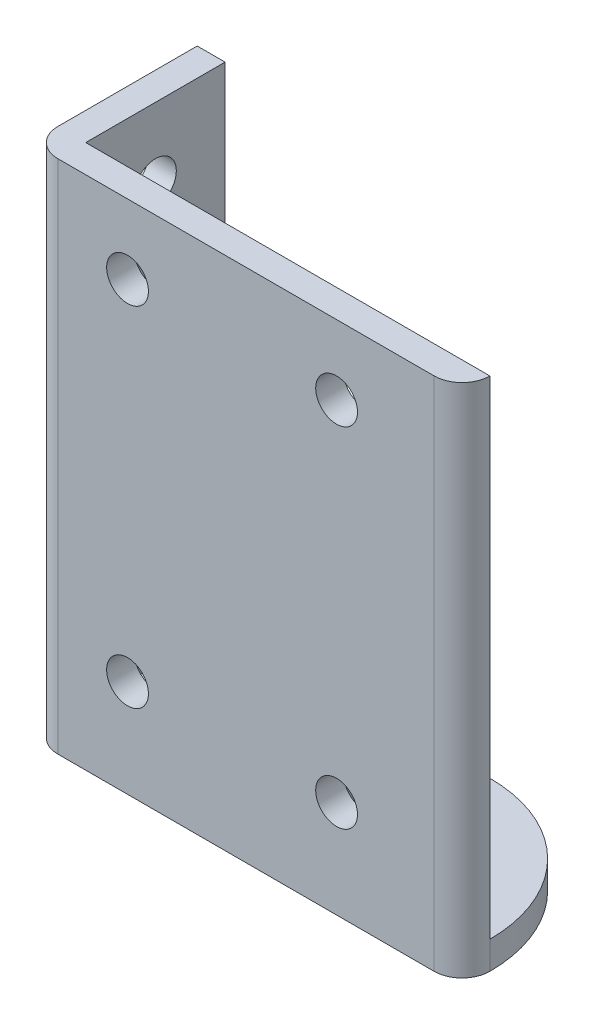
ISO-10303-21;
HEADER;
FILE_DESCRIPTION(('STEP AP214'),'2;1');
FILE_NAME('part.step','',(''),(''),'','','');
FILE_SCHEMA(('AUTOMOTIVE_DESIGN { 1 0 10303 214 1 1 1 1 }'));
ENDSEC;
DATA;
#1=APPLICATION_CONTEXT('core data for automotive mechanical design processes');
#2=APPLICATION_PROTOCOL_DEFINITION('international standard','automotive_design',2000,#1);
#3=PRODUCT_CONTEXT('',#1,'mechanical');
#4=PRODUCT('Part','Part','',(#3));
#5=PRODUCT_RELATED_PRODUCT_CATEGORY('part','',(#4));
#6=PRODUCT_DEFINITION_FORMATION('','',#4);
#7=PRODUCT_DEFINITION_CONTEXT('part definition',#1,'design');
#8=PRODUCT_DEFINITION('design','',#6,#7);
#9=PRODUCT_DEFINITION_SHAPE('','',#8);
#10=(LENGTH_UNIT() NAMED_UNIT(*) SI_UNIT(.MILLI.,.METRE.));
#11=(NAMED_UNIT(*) PLANE_ANGLE_UNIT() SI_UNIT($,.RADIAN.));
#12=(NAMED_UNIT(*) SI_UNIT($,.STERADIAN.) SOLID_ANGLE_UNIT());
#13=UNCERTAINTY_MEASURE_WITH_UNIT(LENGTH_MEASURE(1.E-05),#10,'distance_accuracy_value','');
#14=(GEOMETRIC_REPRESENTATION_CONTEXT(3) GLOBAL_UNCERTAINTY_ASSIGNED_CONTEXT((#13)) GLOBAL_UNIT_ASSIGNED_CONTEXT((#10,
#11,#12)) REPRESENTATION_CONTEXT('',''));
#15=CARTESIAN_POINT('',(0.,0.,0.));
#16=DIRECTION('',(0.,0.,1.));
#17=DIRECTION('',(1.,0.,0.));
#18=AXIS2_PLACEMENT_3D('',#15,#16,#17);
#19=CARTESIAN_POINT('',(42.,4.,-4.));
#20=DIRECTION('',(0.,-1.,0.));
#21=DIRECTION('',(0.,0.,-1.));
#22=AXIS2_PLACEMENT_3D('',#19,#20,#21);
#23=PLANE('',#22);
#24=CARTESIAN_POINT('',(34.,4.,-14.));
#25=DIRECTION('',(0.,1.,0.));
#26=DIRECTION('',(0.,0.,1.));
#27=AXIS2_PLACEMENT_3D('',#24,#25,#26);
#28=CIRCLE('',#27,3.);
#29=CARTESIAN_POINT('',(34.,4.,-11.));
#30=VERTEX_POINT('',#29);
#31=EDGE_CURVE('E158',#30,#30,#28,.T.);
#32=ORIENTED_EDGE('',*,*,#31,.F.);
#33=EDGE_LOOP('',(#32));
#34=FACE_BOUND('',#33,.T.);
#35=DIRECTION('',(0.,0.,-1.));
#36=VECTOR('',#35,1.);
#37=CARTESIAN_POINT('',(4.,4.,-24.));
#38=LINE('',#37,#36);
#39=CARTESIAN_POINT('',(4.,4.,-4.));
#40=VERTEX_POINT('',#39);
#41=CARTESIAN_POINT('',(4.,4.,-24.));
#42=VERTEX_POINT('',#41);
#43=EDGE_CURVE('E125',#40,#42,#38,.T.);
#44=ORIENTED_EDGE('',*,*,#43,.F.);
#45=DIRECTION('',(-1.,0.,0.));
#46=VECTOR('',#45,1.);
#47=CARTESIAN_POINT('',(4.,4.,-4.));
#48=LINE('',#47,#46);
#49=CARTESIAN_POINT('',(62.,4.,-4.));
#50=VERTEX_POINT('',#49);
#51=EDGE_CURVE('E133',#50,#40,#48,.T.);
#52=ORIENTED_EDGE('',*,*,#51,.F.);
#53=CARTESIAN_POINT('',(42.,4.,-4.));
#54=DIRECTION('',(0.,1.,0.));
#55=DIRECTION('',(0.,0.,-1.));
#56=AXIS2_PLACEMENT_3D('',#53,#54,#55);
#57=CIRCLE('',#56,20.);
#58=CARTESIAN_POINT('',(42.,4.,-24.));
#59=VERTEX_POINT('',#58);
#60=EDGE_CURVE('E56',#50,#59,#57,.T.);
#61=ORIENTED_EDGE('',*,*,#60,.T.);
#62=DIRECTION('',(-1.,0.,0.));
#63=VECTOR('',#62,1.);
#64=CARTESIAN_POINT('',(0.,4.,-24.));
#65=LINE('',#64,#63);
#66=EDGE_CURVE('E50',#59,#42,#65,.T.);
#67=ORIENTED_EDGE('',*,*,#66,.T.);
#68=EDGE_LOOP('',(#44,#52,#61,#67));
#69=FACE_BOUND('',#68,.T.);
#70=ADVANCED_FACE('F33',(#34,#69),#23,.F.);
#71=CARTESIAN_POINT('',(0.,4.,-24.));
#72=DIRECTION('',(0.,0.,1.));
#73=DIRECTION('',(1.,0.,0.));
#74=AXIS2_PLACEMENT_3D('',#71,#72,#73);
#75=PLANE('',#74);
#76=DIRECTION('',(-1.,0.,0.));
#77=VECTOR('',#76,1.);
#78=CARTESIAN_POINT('',(0.,0.,-24.));
#79=LINE('',#78,#77);
#80=CARTESIAN_POINT('',(42.,0.,-24.));
#81=VERTEX_POINT('',#80);
#82=CARTESIAN_POINT('',(0.,0.,-24.));
#83=VERTEX_POINT('',#82);
#84=EDGE_CURVE('E95',#81,#83,#79,.T.);
#85=ORIENTED_EDGE('',*,*,#84,.T.);
#86=DIRECTION('',(0.,-1.,0.));
#87=VECTOR('',#86,1.);
#88=CARTESIAN_POINT('',(0.,4.,-24.));
#89=LINE('',#88,#87);
#90=CARTESIAN_POINT('',(0.,74.,-24.));
#91=VERTEX_POINT('',#90);
#92=EDGE_CURVE('E11',#91,#83,#89,.T.);
#93=ORIENTED_EDGE('',*,*,#92,.F.);
#94=DIRECTION('',(-1.,0.,0.));
#95=VECTOR('',#94,1.);
#96=CARTESIAN_POINT('',(4.,74.,-24.));
#97=LINE('',#96,#95);
#98=CARTESIAN_POINT('',(4.,74.,-24.));
#99=VERTEX_POINT('',#98);
#100=EDGE_CURVE('E146',#99,#91,#97,.T.);
#101=ORIENTED_EDGE('',*,*,#100,.F.);
#102=DIRECTION('',(0.,-1.,0.));
#103=VECTOR('',#102,1.);
#104=CARTESIAN_POINT('',(4.,74.,-24.));
#105=LINE('',#104,#103);
#106=EDGE_CURVE('E130',#99,#42,#105,.T.);
#107=ORIENTED_EDGE('',*,*,#106,.T.);
#108=ORIENTED_EDGE('',*,*,#66,.F.);
#109=DIRECTION('',(0.,-1.,0.));
#110=VECTOR('',#109,1.);
#111=CARTESIAN_POINT('',(42.,4.,-24.));
#112=LINE('',#111,#110);
#113=EDGE_CURVE('E84',#59,#81,#112,.T.);
#114=ORIENTED_EDGE('',*,*,#113,.T.);
#115=EDGE_LOOP('',(#85,#93,#101,#107,#108,#114));
#116=FACE_BOUND('',#115,.T.);
#117=ADVANCED_FACE('F35',(#116),#75,.F.);
#118=CARTESIAN_POINT('',(0.,4.,-4.00000000000003));
#119=DIRECTION('',(1.,0.,0.));
#120=DIRECTION('',(0.,0.,-1.));
#121=AXIS2_PLACEMENT_3D('',#118,#119,#120);
#122=PLANE('',#121);
#123=CARTESIAN_POINT('',(0.,14.,-14.));
#124=DIRECTION('',(1.,0.,0.));
#125=DIRECTION('',(0.,0.,-1.));
#126=AXIS2_PLACEMENT_3D('',#123,#124,#125);
#127=CIRCLE('',#126,3.);
#128=CARTESIAN_POINT('',(0.,14.,-17.));
#129=VERTEX_POINT('',#128);
#130=EDGE_CURVE('E167',#129,#129,#127,.T.);
#131=ORIENTED_EDGE('',*,*,#130,.T.);
#132=EDGE_LOOP('',(#131));
#133=FACE_BOUND('',#132,.T.);
#134=CARTESIAN_POINT('',(0.,64.,-14.));
#135=DIRECTION('',(1.,0.,0.));
#136=DIRECTION('',(0.,0.,-1.));
#137=AXIS2_PLACEMENT_3D('',#134,#135,#136);
#138=CIRCLE('',#137,3.);
#139=CARTESIAN_POINT('',(0.,64.,-17.));
#140=VERTEX_POINT('',#139);
#141=EDGE_CURVE('E161',#140,#140,#138,.T.);
#142=ORIENTED_EDGE('',*,*,#141,.T.);
#143=EDGE_LOOP('',(#142));
#144=FACE_BOUND('',#143,.T.);
#145=DIRECTION('',(0.,0.,1.));
#146=VECTOR('',#145,1.);
#147=CARTESIAN_POINT('',(0.,0.,-4.00000000000003));
#148=LINE('',#147,#146);
#149=CARTESIAN_POINT('',(0.,0.,-4.00000000000003));
#150=VERTEX_POINT('',#149);
#151=EDGE_CURVE('E100',#83,#150,#148,.T.);
#152=ORIENTED_EDGE('',*,*,#151,.T.);
#153=DIRECTION('',(0.,-1.,0.));
#154=VECTOR('',#153,1.);
#155=CARTESIAN_POINT('',(0.,4.,-4.00000000000003));
#156=LINE('',#155,#154);
#157=CARTESIAN_POINT('',(0.,74.,-4.00000000000003));
#158=VERTEX_POINT('',#157);
#159=EDGE_CURVE('E42',#158,#150,#156,.T.);
#160=ORIENTED_EDGE('',*,*,#159,.F.);
#161=DIRECTION('',(0.,0.,1.));
#162=VECTOR('',#161,1.);
#163=CARTESIAN_POINT('',(0.,74.,-24.));
#164=LINE('',#163,#162);
#165=EDGE_CURVE('E143',#91,#158,#164,.T.);
#166=ORIENTED_EDGE('',*,*,#165,.F.);
#167=ORIENTED_EDGE('',*,*,#92,.T.);
#168=EDGE_LOOP('',(#152,#160,#166,#167));
#169=FACE_BOUND('',#168,.T.);
#170=ADVANCED_FACE('F258',(#133,#144,#169),#122,.F.);
#171=CARTESIAN_POINT('',(4.,4.,-4.));
#172=DIRECTION('',(0.,-1.,0.));
#173=DIRECTION('',(0.,0.,-1.));
#174=AXIS2_PLACEMENT_3D('',#171,#172,#173);
#175=CYLINDRICAL_SURFACE('',#174,4.);
#176=CARTESIAN_POINT('',(4.,0.,-4.));
#177=DIRECTION('',(0.,1.,0.));
#178=DIRECTION('',(0.,0.,1.));
#179=AXIS2_PLACEMENT_3D('',#176,#177,#178);
#180=CIRCLE('',#179,4.);
#181=CARTESIAN_POINT('',(4.00000000000003,0.,0.));
#182=VERTEX_POINT('',#181);
#183=EDGE_CURVE('E103',#150,#182,#180,.T.);
#184=ORIENTED_EDGE('',*,*,#183,.T.);
#185=DIRECTION('',(0.,-1.,0.));
#186=VECTOR('',#185,1.);
#187=CARTESIAN_POINT('',(4.00000000000003,4.,0.));
#188=LINE('',#187,#186);
#189=CARTESIAN_POINT('',(4.00000000000003,74.,0.));
#190=VERTEX_POINT('',#189);
#191=EDGE_CURVE('E119',#190,#182,#188,.T.);
#192=ORIENTED_EDGE('',*,*,#191,.F.);
#193=CARTESIAN_POINT('',(4.,74.,-4.));
#194=DIRECTION('',(0.,1.,0.));
#195=DIRECTION('',(0.,0.,1.));
#196=AXIS2_PLACEMENT_3D('',#193,#194,#195);
#197=CIRCLE('',#196,4.);
#198=EDGE_CURVE('E140',#158,#190,#197,.T.);
#199=ORIENTED_EDGE('',*,*,#198,.F.);
#200=ORIENTED_EDGE('',*,*,#159,.T.);
#201=EDGE_LOOP('',(#184,#192,#199,#200));
#202=FACE_BOUND('',#201,.T.);
#203=ADVANCED_FACE('F256',(#202),#175,.T.);
#204=CARTESIAN_POINT('',(4.00000000000003,4.,0.));
#205=DIRECTION('',(0.,0.,-1.));
#206=DIRECTION('',(-1.,0.,0.));
#207=AXIS2_PLACEMENT_3D('',#204,#205,#206);
#208=PLANE('',#207);
#209=CARTESIAN_POINT('',(44.,64.,0.));
#210=DIRECTION('',(0.,0.,-1.));
#211=DIRECTION('',(-1.,0.,0.));
#212=AXIS2_PLACEMENT_3D('',#209,#210,#211);
#213=CIRCLE('',#212,3.);
#214=CARTESIAN_POINT('',(41.,64.,0.));
#215=VERTEX_POINT('',#214);
#216=EDGE_CURVE('E191',#215,#215,#213,.T.);
#217=ORIENTED_EDGE('',*,*,#216,.T.);
#218=EDGE_LOOP('',(#217));
#219=FACE_BOUND('',#218,.T.);
#220=CARTESIAN_POINT('',(14.,64.,0.));
#221=DIRECTION('',(0.,0.,-1.));
#222=DIRECTION('',(-1.,0.,0.));
#223=AXIS2_PLACEMENT_3D('',#220,#221,#222);
#224=CIRCLE('',#223,3.);
#225=CARTESIAN_POINT('',(11.,64.,0.));
#226=VERTEX_POINT('',#225);
#227=EDGE_CURVE('E185',#226,#226,#224,.T.);
#228=ORIENTED_EDGE('',*,*,#227,.T.);
#229=EDGE_LOOP('',(#228));
#230=FACE_BOUND('',#229,.T.);
#231=CARTESIAN_POINT('',(44.,14.,0.));
#232=DIRECTION('',(0.,0.,-1.));
#233=DIRECTION('',(-1.,0.,0.));
#234=AXIS2_PLACEMENT_3D('',#231,#232,#233);
#235=CIRCLE('',#234,3.);
#236=CARTESIAN_POINT('',(41.,14.,0.));
#237=VERTEX_POINT('',#236);
#238=EDGE_CURVE('E179',#237,#237,#235,.T.);
#239=ORIENTED_EDGE('',*,*,#238,.T.);
#240=EDGE_LOOP('',(#239));
#241=FACE_BOUND('',#240,.T.);
#242=CARTESIAN_POINT('',(14.,14.,0.));
#243=DIRECTION('',(0.,0.,-1.));
#244=DIRECTION('',(-1.,0.,0.));
#245=AXIS2_PLACEMENT_3D('',#242,#243,#244);
#246=CIRCLE('',#245,3.);
#247=CARTESIAN_POINT('',(11.,14.,0.));
#248=VERTEX_POINT('',#247);
#249=EDGE_CURVE('E173',#248,#248,#246,.T.);
#250=ORIENTED_EDGE('',*,*,#249,.T.);
#251=EDGE_LOOP('',(#250));
#252=FACE_BOUND('',#251,.T.);
#253=DIRECTION('',(1.,0.,0.));
#254=VECTOR('',#253,1.);
#255=CARTESIAN_POINT('',(4.00000000000003,0.,0.));
#256=LINE('',#255,#254);
#257=CARTESIAN_POINT('',(58.,0.,0.));
#258=VERTEX_POINT('',#257);
#259=EDGE_CURVE('E112',#182,#258,#256,.T.);
#260=ORIENTED_EDGE('',*,*,#259,.T.);
#261=DIRECTION('',(0.,-1.,0.));
#262=VECTOR('',#261,1.);
#263=CARTESIAN_POINT('',(58.,4.,0.));
#264=LINE('',#263,#262);
#265=CARTESIAN_POINT('',(58.,74.,0.));
#266=VERTEX_POINT('',#265);
#267=EDGE_CURVE('E116',#266,#258,#264,.T.);
#268=ORIENTED_EDGE('',*,*,#267,.F.);
#269=DIRECTION('',(1.,0.,0.));
#270=VECTOR('',#269,1.);
#271=CARTESIAN_POINT('',(4.00000000000003,74.,0.));
#272=LINE('',#271,#270);
#273=EDGE_CURVE('E137',#190,#266,#272,.T.);
#274=ORIENTED_EDGE('',*,*,#273,.F.);
#275=ORIENTED_EDGE('',*,*,#191,.T.);
#276=EDGE_LOOP('',(#260,#268,#274,#275));
#277=FACE_BOUND('',#276,.T.);
#278=ADVANCED_FACE('F200',(#219,#230,#241,#252,#277),#208,.F.);
#279=CARTESIAN_POINT('',(58.,4.,-4.));
#280=DIRECTION('',(0.,-1.,0.));
#281=DIRECTION('',(0.,0.,-1.));
#282=AXIS2_PLACEMENT_3D('',#279,#280,#281);
#283=CYLINDRICAL_SURFACE('',#282,4.);
#284=CARTESIAN_POINT('',(58.,0.,-4.));
#285=DIRECTION('',(0.,1.,0.));
#286=DIRECTION('',(0.,0.,-1.));
#287=AXIS2_PLACEMENT_3D('',#284,#285,#286);
#288=CIRCLE('',#287,4.);
#289=CARTESIAN_POINT('',(62.,0.,-4.));
#290=VERTEX_POINT('',#289);
#291=EDGE_CURVE('E90',#258,#290,#288,.T.);
#292=ORIENTED_EDGE('',*,*,#291,.T.);
#293=DIRECTION('',(0.,-1.,0.));
#294=VECTOR('',#293,1.);
#295=CARTESIAN_POINT('',(62.,4.,-4.));
#296=LINE('',#295,#294);
#297=EDGE_CURVE('E86',#50,#290,#296,.T.);
#298=ORIENTED_EDGE('',*,*,#297,.F.);
#299=DIRECTION('',(0.,-1.,0.));
#300=VECTOR('',#299,1.);
#301=CARTESIAN_POINT('',(62.,74.,-4.));
#302=LINE('',#301,#300);
#303=CARTESIAN_POINT('',(62.,74.,-4.));
#304=VERTEX_POINT('',#303);
#305=EDGE_CURVE('E101',#304,#50,#302,.T.);
#306=ORIENTED_EDGE('',*,*,#305,.F.);
#307=CARTESIAN_POINT('',(58.,74.,-4.));
#308=DIRECTION('',(0.,1.,0.));
#309=DIRECTION('',(0.,0.,1.));
#310=AXIS2_PLACEMENT_3D('',#307,#308,#309);
#311=CIRCLE('',#310,4.);
#312=EDGE_CURVE('E155',#266,#304,#311,.T.);
#313=ORIENTED_EDGE('',*,*,#312,.F.);
#314=ORIENTED_EDGE('',*,*,#267,.T.);
#315=EDGE_LOOP('',(#292,#298,#306,#313,#314));
#316=FACE_BOUND('',#315,.T.);
#317=ADVANCED_FACE('F254',(#316),#283,.T.);
#318=CARTESIAN_POINT('',(42.,4.,-4.));
#319=DIRECTION('',(0.,-1.,0.));
#320=DIRECTION('',(0.,0.,-1.));
#321=AXIS2_PLACEMENT_3D('',#318,#319,#320);
#322=CYLINDRICAL_SURFACE('',#321,20.);
#323=CARTESIAN_POINT('',(42.,0.,-4.));
#324=DIRECTION('',(0.,1.,0.));
#325=DIRECTION('',(0.,0.,-1.));
#326=AXIS2_PLACEMENT_3D('',#323,#324,#325);
#327=CIRCLE('',#326,20.);
#328=EDGE_CURVE('E81',#290,#81,#327,.T.);
#329=ORIENTED_EDGE('',*,*,#328,.T.);
#330=ORIENTED_EDGE('',*,*,#113,.F.);
#331=ORIENTED_EDGE('',*,*,#60,.F.);
#332=ORIENTED_EDGE('',*,*,#297,.T.);
#333=EDGE_LOOP('',(#329,#330,#331,#332));
#334=FACE_BOUND('',#333,.T.);
#335=ADVANCED_FACE('F83',(#334),#322,.T.);
#336=CARTESIAN_POINT('',(42.,0.,-4.));
#337=DIRECTION('',(0.,-1.,0.));
#338=DIRECTION('',(0.,0.,-1.));
#339=AXIS2_PLACEMENT_3D('',#336,#337,#338);
#340=PLANE('',#339);
#341=CARTESIAN_POINT('',(34.,0.,-14.));
#342=DIRECTION('',(0.,1.,0.));
#343=DIRECTION('',(0.,0.,1.));
#344=AXIS2_PLACEMENT_3D('',#341,#342,#343);
#345=CIRCLE('',#344,3.);
#346=CARTESIAN_POINT('',(34.,0.,-11.));
#347=VERTEX_POINT('',#346);
#348=EDGE_CURVE('E136',#347,#347,#345,.T.);
#349=ORIENTED_EDGE('',*,*,#348,.T.);
#350=EDGE_LOOP('',(#349));
#351=FACE_BOUND('',#350,.T.);
#352=ORIENTED_EDGE('',*,*,#84,.F.);
#353=ORIENTED_EDGE('',*,*,#328,.F.);
#354=ORIENTED_EDGE('',*,*,#291,.F.);
#355=ORIENTED_EDGE('',*,*,#259,.F.);
#356=ORIENTED_EDGE('',*,*,#183,.F.);
#357=ORIENTED_EDGE('',*,*,#151,.F.);
#358=EDGE_LOOP('',(#352,#353,#354,#355,#356,#357));
#359=FACE_BOUND('',#358,.T.);
#360=ADVANCED_FACE('F98',(#351,#359),#340,.T.);
#361=CARTESIAN_POINT('',(4.,74.,-4.));
#362=DIRECTION('',(0.,0.,1.));
#363=DIRECTION('',(1.,0.,0.));
#364=AXIS2_PLACEMENT_3D('',#361,#362,#363);
#365=PLANE('',#364);
#366=CARTESIAN_POINT('',(44.,64.,-4.));
#367=DIRECTION('',(0.,0.,-1.));
#368=DIRECTION('',(-1.,0.,0.));
#369=AXIS2_PLACEMENT_3D('',#366,#367,#368);
#370=CIRCLE('',#369,3.);
#371=CARTESIAN_POINT('',(41.,64.,-4.));
#372=VERTEX_POINT('',#371);
#373=EDGE_CURVE('E194',#372,#372,#370,.T.);
#374=ORIENTED_EDGE('',*,*,#373,.F.);
#375=EDGE_LOOP('',(#374));
#376=FACE_BOUND('',#375,.T.);
#377=CARTESIAN_POINT('',(14.,64.,-4.));
#378=DIRECTION('',(0.,0.,-1.));
#379=DIRECTION('',(-1.,0.,0.));
#380=AXIS2_PLACEMENT_3D('',#377,#378,#379);
#381=CIRCLE('',#380,3.);
#382=CARTESIAN_POINT('',(11.,64.,-4.));
#383=VERTEX_POINT('',#382);
#384=EDGE_CURVE('E188',#383,#383,#381,.T.);
#385=ORIENTED_EDGE('',*,*,#384,.F.);
#386=EDGE_LOOP('',(#385));
#387=FACE_BOUND('',#386,.T.);
#388=CARTESIAN_POINT('',(44.,14.,-4.));
#389=DIRECTION('',(0.,0.,-1.));
#390=DIRECTION('',(-1.,0.,0.));
#391=AXIS2_PLACEMENT_3D('',#388,#389,#390);
#392=CIRCLE('',#391,3.);
#393=CARTESIAN_POINT('',(41.,14.,-4.));
#394=VERTEX_POINT('',#393);
#395=EDGE_CURVE('E182',#394,#394,#392,.T.);
#396=ORIENTED_EDGE('',*,*,#395,.F.);
#397=EDGE_LOOP('',(#396));
#398=FACE_BOUND('',#397,.T.);
#399=CARTESIAN_POINT('',(14.,14.,-4.));
#400=DIRECTION('',(0.,0.,-1.));
#401=DIRECTION('',(-1.,0.,0.));
#402=AXIS2_PLACEMENT_3D('',#399,#400,#401);
#403=CIRCLE('',#402,3.);
#404=CARTESIAN_POINT('',(11.,14.,-4.));
#405=VERTEX_POINT('',#404);
#406=EDGE_CURVE('E176',#405,#405,#403,.T.);
#407=ORIENTED_EDGE('',*,*,#406,.F.);
#408=EDGE_LOOP('',(#407));
#409=FACE_BOUND('',#408,.T.);
#410=ORIENTED_EDGE('',*,*,#51,.T.);
#411=DIRECTION('',(0.,-1.,0.));
#412=VECTOR('',#411,1.);
#413=CARTESIAN_POINT('',(4.,74.,-4.));
#414=LINE('',#413,#412);
#415=CARTESIAN_POINT('',(4.,74.,-4.));
#416=VERTEX_POINT('',#415);
#417=EDGE_CURVE('E106',#416,#40,#414,.T.);
#418=ORIENTED_EDGE('',*,*,#417,.F.);
#419=DIRECTION('',(-1.,0.,0.));
#420=VECTOR('',#419,1.);
#421=CARTESIAN_POINT('',(4.,74.,-4.));
#422=LINE('',#421,#420);
#423=EDGE_CURVE('E152',#304,#416,#422,.T.);
#424=ORIENTED_EDGE('',*,*,#423,.F.);
#425=ORIENTED_EDGE('',*,*,#305,.T.);
#426=EDGE_LOOP('',(#410,#418,#424,#425));
#427=FACE_BOUND('',#426,.T.);
#428=ADVANCED_FACE('F210',(#376,#387,#398,#409,#427),#365,.F.);
#429=CARTESIAN_POINT('',(4.,74.,-24.));
#430=DIRECTION('',(-1.,0.,0.));
#431=DIRECTION('',(0.,0.,1.));
#432=AXIS2_PLACEMENT_3D('',#429,#430,#431);
#433=PLANE('',#432);
#434=CARTESIAN_POINT('',(4.,14.,-14.));
#435=DIRECTION('',(1.,0.,0.));
#436=DIRECTION('',(0.,0.,-1.));
#437=AXIS2_PLACEMENT_3D('',#434,#435,#436);
#438=CIRCLE('',#437,3.);
#439=CARTESIAN_POINT('',(4.,14.,-17.));
#440=VERTEX_POINT('',#439);
#441=EDGE_CURVE('E170',#440,#440,#438,.T.);
#442=ORIENTED_EDGE('',*,*,#441,.F.);
#443=EDGE_LOOP('',(#442));
#444=FACE_BOUND('',#443,.T.);
#445=CARTESIAN_POINT('',(4.,64.,-14.));
#446=DIRECTION('',(1.,0.,0.));
#447=DIRECTION('',(0.,0.,-1.));
#448=AXIS2_PLACEMENT_3D('',#445,#446,#447);
#449=CIRCLE('',#448,3.);
#450=CARTESIAN_POINT('',(4.,64.,-17.));
#451=VERTEX_POINT('',#450);
#452=EDGE_CURVE('E164',#451,#451,#449,.T.);
#453=ORIENTED_EDGE('',*,*,#452,.F.);
#454=EDGE_LOOP('',(#453));
#455=FACE_BOUND('',#454,.T.);
#456=ORIENTED_EDGE('',*,*,#43,.T.);
#457=ORIENTED_EDGE('',*,*,#106,.F.);
#458=DIRECTION('',(0.,0.,-1.));
#459=VECTOR('',#458,1.);
#460=CARTESIAN_POINT('',(4.,74.,-24.));
#461=LINE('',#460,#459);
#462=EDGE_CURVE('E149',#416,#99,#461,.T.);
#463=ORIENTED_EDGE('',*,*,#462,.F.);
#464=ORIENTED_EDGE('',*,*,#417,.T.);
#465=EDGE_LOOP('',(#456,#457,#463,#464));
#466=FACE_BOUND('',#465,.T.);
#467=ADVANCED_FACE('F213',(#444,#455,#466),#433,.F.);
#468=CARTESIAN_POINT('',(58.,74.,-4.));
#469=DIRECTION('',(0.,1.,0.));
#470=DIRECTION('',(0.,0.,1.));
#471=AXIS2_PLACEMENT_3D('',#468,#469,#470);
#472=PLANE('',#471);
#473=ORIENTED_EDGE('',*,*,#312,.T.);
#474=ORIENTED_EDGE('',*,*,#423,.T.);
#475=ORIENTED_EDGE('',*,*,#462,.T.);
#476=ORIENTED_EDGE('',*,*,#100,.T.);
#477=ORIENTED_EDGE('',*,*,#165,.T.);
#478=ORIENTED_EDGE('',*,*,#198,.T.);
#479=ORIENTED_EDGE('',*,*,#273,.T.);
#480=EDGE_LOOP('',(#473,#474,#475,#476,#477,#478,#479));
#481=FACE_BOUND('',#480,.T.);
#482=ADVANCED_FACE('F234',(#481),#472,.T.);
#483=CARTESIAN_POINT('',(34.,0.,-14.));
#484=DIRECTION('',(0.,1.,0.));
#485=DIRECTION('',(0.,0.,1.));
#486=AXIS2_PLACEMENT_3D('',#483,#484,#485);
#487=CYLINDRICAL_SURFACE('',#486,3.);
#488=ORIENTED_EDGE('',*,*,#348,.F.);
#489=EDGE_LOOP('',(#488));
#490=FACE_BOUND('',#489,.T.);
#491=ORIENTED_EDGE('',*,*,#31,.T.);
#492=EDGE_LOOP('',(#491));
#493=FACE_BOUND('',#492,.T.);
#494=ADVANCED_FACE('F319',(#490,#493),#487,.F.);
#495=CARTESIAN_POINT('',(0.,64.,-14.));
#496=DIRECTION('',(1.,0.,0.));
#497=DIRECTION('',(0.,0.,-1.));
#498=AXIS2_PLACEMENT_3D('',#495,#496,#497);
#499=CYLINDRICAL_SURFACE('',#498,3.);
#500=ORIENTED_EDGE('',*,*,#141,.F.);
#501=EDGE_LOOP('',(#500));
#502=FACE_BOUND('',#501,.T.);
#503=ORIENTED_EDGE('',*,*,#452,.T.);
#504=EDGE_LOOP('',(#503));
#505=FACE_BOUND('',#504,.T.);
#506=ADVANCED_FACE('F325',(#502,#505),#499,.F.);
#507=CARTESIAN_POINT('',(0.,14.,-14.));
#508=DIRECTION('',(1.,0.,0.));
#509=DIRECTION('',(0.,0.,-1.));
#510=AXIS2_PLACEMENT_3D('',#507,#508,#509);
#511=CYLINDRICAL_SURFACE('',#510,3.);
#512=ORIENTED_EDGE('',*,*,#130,.F.);
#513=EDGE_LOOP('',(#512));
#514=FACE_BOUND('',#513,.T.);
#515=ORIENTED_EDGE('',*,*,#441,.T.);
#516=EDGE_LOOP('',(#515));
#517=FACE_BOUND('',#516,.T.);
#518=ADVANCED_FACE('F332',(#514,#517),#511,.F.);
#519=CARTESIAN_POINT('',(14.,14.,0.));
#520=DIRECTION('',(0.,0.,-1.));
#521=DIRECTION('',(-1.,0.,0.));
#522=AXIS2_PLACEMENT_3D('',#519,#520,#521);
#523=CYLINDRICAL_SURFACE('',#522,3.);
#524=ORIENTED_EDGE('',*,*,#249,.F.);
#525=EDGE_LOOP('',(#524));
#526=FACE_BOUND('',#525,.T.);
#527=ORIENTED_EDGE('',*,*,#406,.T.);
#528=EDGE_LOOP('',(#527));
#529=FACE_BOUND('',#528,.T.);
#530=ADVANCED_FACE('F339',(#526,#529),#523,.F.);
#531=CARTESIAN_POINT('',(44.,14.,0.));
#532=DIRECTION('',(0.,0.,-1.));
#533=DIRECTION('',(-1.,0.,0.));
#534=AXIS2_PLACEMENT_3D('',#531,#532,#533);
#535=CYLINDRICAL_SURFACE('',#534,3.);
#536=ORIENTED_EDGE('',*,*,#238,.F.);
#537=EDGE_LOOP('',(#536));
#538=FACE_BOUND('',#537,.T.);
#539=ORIENTED_EDGE('',*,*,#395,.T.);
#540=EDGE_LOOP('',(#539));
#541=FACE_BOUND('',#540,.T.);
#542=ADVANCED_FACE('F346',(#538,#541),#535,.F.);
#543=CARTESIAN_POINT('',(14.,64.,0.));
#544=DIRECTION('',(0.,0.,-1.));
#545=DIRECTION('',(-1.,0.,0.));
#546=AXIS2_PLACEMENT_3D('',#543,#544,#545);
#547=CYLINDRICAL_SURFACE('',#546,3.);
#548=ORIENTED_EDGE('',*,*,#227,.F.);
#549=EDGE_LOOP('',(#548));
#550=FACE_BOUND('',#549,.T.);
#551=ORIENTED_EDGE('',*,*,#384,.T.);
#552=EDGE_LOOP('',(#551));
#553=FACE_BOUND('',#552,.T.);
#554=ADVANCED_FACE('F206',(#550,#553),#547,.F.);
#555=CARTESIAN_POINT('',(44.,64.,0.));
#556=DIRECTION('',(0.,0.,-1.));
#557=DIRECTION('',(-1.,0.,0.));
#558=AXIS2_PLACEMENT_3D('',#555,#556,#557);
#559=CYLINDRICAL_SURFACE('',#558,3.);
#560=ORIENTED_EDGE('',*,*,#216,.F.);
#561=EDGE_LOOP('',(#560));
#562=FACE_BOUND('',#561,.T.);
#563=ORIENTED_EDGE('',*,*,#373,.T.);
#564=EDGE_LOOP('',(#563));
#565=FACE_BOUND('',#564,.T.);
#566=ADVANCED_FACE('F203',(#562,#565),#559,.F.);
#567=CLOSED_SHELL('',(#70,#117,#170,#203,#278,#317,#335,#360,#428,#467,#482,#494,#506,#518,#530,
#542,#554,#566));
#568=MANIFOLD_SOLID_BREP('B2',#567);
#569=ADVANCED_BREP_SHAPE_REPRESENTATION('',(#18,#568),#14);
#570=SHAPE_DEFINITION_REPRESENTATION(#9,#569);
ENDSEC;
END-ISO-10303-21;
